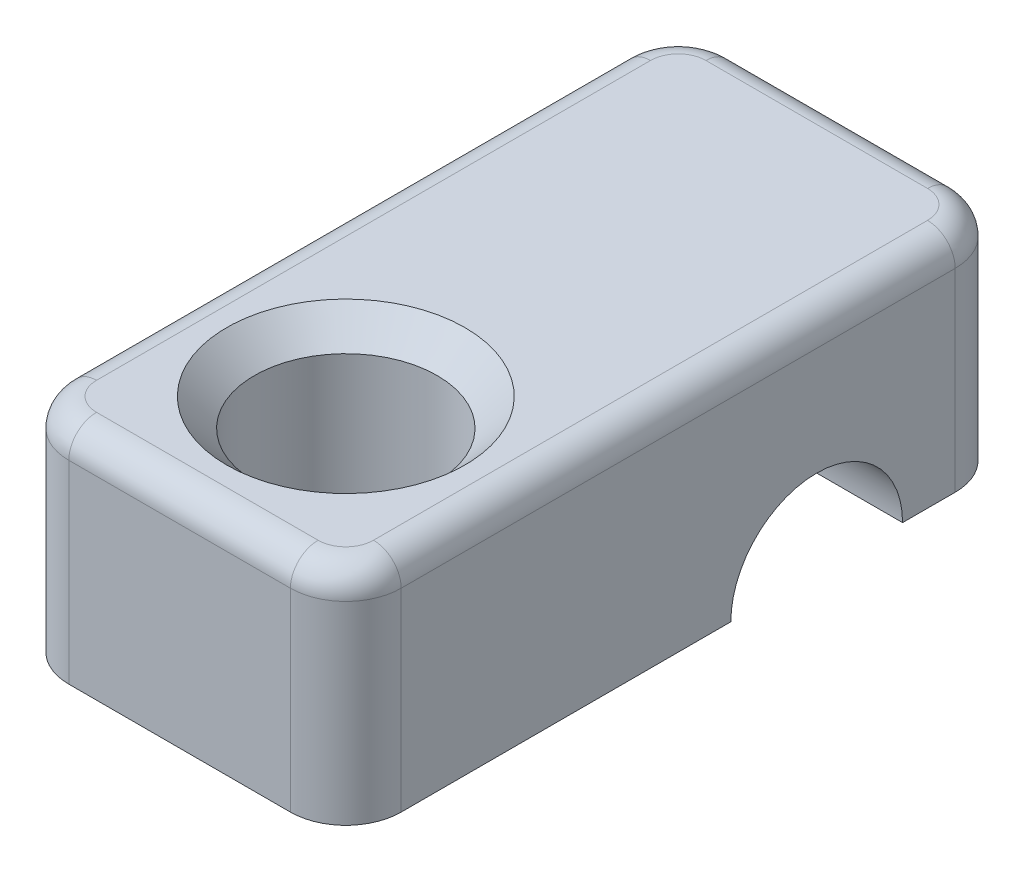
ISO-10303-21;
HEADER;
FILE_DESCRIPTION(('STEP AP214'),'2;1');
FILE_NAME('part.step','',(''),(''),'','','');
FILE_SCHEMA(('AUTOMOTIVE_DESIGN { 1 0 10303 214 1 1 1 1 }'));
ENDSEC;
DATA;
#1=APPLICATION_CONTEXT('core data for automotive mechanical design processes');
#2=APPLICATION_PROTOCOL_DEFINITION('international standard','automotive_design',2000,#1);
#3=PRODUCT_CONTEXT('',#1,'mechanical');
#4=PRODUCT('Part','Part','',(#3));
#5=PRODUCT_RELATED_PRODUCT_CATEGORY('part','',(#4));
#6=PRODUCT_DEFINITION_FORMATION('','',#4);
#7=PRODUCT_DEFINITION_CONTEXT('part definition',#1,'design');
#8=PRODUCT_DEFINITION('design','',#6,#7);
#9=PRODUCT_DEFINITION_SHAPE('','',#8);
#10=(LENGTH_UNIT() NAMED_UNIT(*) SI_UNIT(.MILLI.,.METRE.));
#11=(NAMED_UNIT(*) PLANE_ANGLE_UNIT() SI_UNIT($,.RADIAN.));
#12=(NAMED_UNIT(*) SI_UNIT($,.STERADIAN.) SOLID_ANGLE_UNIT());
#13=UNCERTAINTY_MEASURE_WITH_UNIT(LENGTH_MEASURE(1.E-05),#10,'distance_accuracy_value','');
#14=(GEOMETRIC_REPRESENTATION_CONTEXT(3) GLOBAL_UNCERTAINTY_ASSIGNED_CONTEXT((#13)) GLOBAL_UNIT_ASSIGNED_CONTEXT((#10,
#11,#12)) REPRESENTATION_CONTEXT('',''));
#15=CARTESIAN_POINT('',(0.,0.,0.));
#16=DIRECTION('',(0.,0.,1.));
#17=DIRECTION('',(1.,0.,0.));
#18=AXIS2_PLACEMENT_3D('',#15,#16,#17);
#19=CARTESIAN_POINT('',(6.,0.,0.));
#20=DIRECTION('',(0.,0.,-1.));
#21=DIRECTION('',(-1.,0.,0.));
#22=AXIS2_PLACEMENT_3D('',#19,#20,#21);
#23=PLANE('',#22);
#24=DIRECTION('',(0.,-1.,0.));
#25=VECTOR('',#24,1.);
#26=CARTESIAN_POINT('',(5.,4.,0.));
#27=LINE('',#26,#25);
#28=CARTESIAN_POINT('',(5.,0.,0.));
#29=VERTEX_POINT('',#28);
#30=CARTESIAN_POINT('',(5.,3.5,0.));
#31=VERTEX_POINT('',#30);
#32=EDGE_CURVE('E203',#29,#31,#27,.F.);
#33=ORIENTED_EDGE('',*,*,#32,.T.);
#34=DIRECTION('',(-1.,0.,0.));
#35=VECTOR('',#34,1.);
#36=CARTESIAN_POINT('',(6.,3.5,0.));
#37=LINE('',#36,#35);
#38=CARTESIAN_POINT('',(1.,3.5,0.));
#39=VERTEX_POINT('',#38);
#40=EDGE_CURVE('E59',#31,#39,#37,.T.);
#41=ORIENTED_EDGE('',*,*,#40,.T.);
#42=DIRECTION('',(0.,-1.,0.));
#43=VECTOR('',#42,1.);
#44=CARTESIAN_POINT('',(1.,0.,0.));
#45=LINE('',#44,#43);
#46=CARTESIAN_POINT('',(1.,0.,0.));
#47=VERTEX_POINT('',#46);
#48=EDGE_CURVE('E201',#39,#47,#45,.T.);
#49=ORIENTED_EDGE('',*,*,#48,.T.);
#50=DIRECTION('',(-1.,0.,0.));
#51=VECTOR('',#50,1.);
#52=CARTESIAN_POINT('',(6.,0.,0.));
#53=LINE('',#52,#51);
#54=EDGE_CURVE('E158',#29,#47,#53,.T.);
#55=ORIENTED_EDGE('',*,*,#54,.F.);
#56=EDGE_LOOP('',(#33,#41,#49,#55));
#57=FACE_BOUND('',#56,.T.);
#58=ADVANCED_FACE('F35',(#57),#23,.F.);
#59=CARTESIAN_POINT('',(6.,0.,0.));
#60=DIRECTION('',(0.,1.,0.));
#61=DIRECTION('',(0.,0.,1.));
#62=AXIS2_PLACEMENT_3D('',#59,#60,#61);
#63=PLANE('',#62);
#64=CARTESIAN_POINT('',(3.,0.,-3.));
#65=DIRECTION('',(0.,-1.,0.));
#66=DIRECTION('',(0.,0.,-1.));
#67=AXIS2_PLACEMENT_3D('',#64,#65,#66);
#68=CIRCLE('',#67,1.65);
#69=CARTESIAN_POINT('',(3.,0.,-4.65));
#70=VERTEX_POINT('',#69);
#71=EDGE_CURVE('E172',#70,#70,#68,.T.);
#72=ORIENTED_EDGE('',*,*,#71,.F.);
#73=EDGE_LOOP('',(#72));
#74=FACE_BOUND('',#73,.T.);
#75=DIRECTION('',(0.,0.,-1.));
#76=VECTOR('',#75,1.);
#77=CARTESIAN_POINT('',(6.,0.,0.));
#78=LINE('',#77,#76);
#79=CARTESIAN_POINT('',(6.,0.,-1.));
#80=VERTEX_POINT('',#79);
#81=CARTESIAN_POINT('',(6.,0.,-6.95));
#82=VERTEX_POINT('',#81);
#83=EDGE_CURVE('E137',#80,#82,#78,.T.);
#84=ORIENTED_EDGE('',*,*,#83,.F.);
#85=CARTESIAN_POINT('',(5.,0.,-1.));
#86=DIRECTION('',(0.,1.,0.));
#87=DIRECTION('',(0.,0.,1.));
#88=AXIS2_PLACEMENT_3D('',#85,#86,#87);
#89=CIRCLE('',#88,1.);
#90=EDGE_CURVE('E199',#80,#29,#89,.F.);
#91=ORIENTED_EDGE('',*,*,#90,.T.);
#92=ORIENTED_EDGE('',*,*,#54,.T.);
#93=CARTESIAN_POINT('',(1.,0.,-1.));
#94=DIRECTION('',(0.,1.,0.));
#95=DIRECTION('',(0.,0.,1.));
#96=AXIS2_PLACEMENT_3D('',#93,#94,#95);
#97=CIRCLE('',#96,1.);
#98=CARTESIAN_POINT('',(0.,0.,-1.));
#99=VERTEX_POINT('',#98);
#100=EDGE_CURVE('E197',#47,#99,#97,.F.);
#101=ORIENTED_EDGE('',*,*,#100,.T.);
#102=DIRECTION('',(0.,0.,-1.));
#103=VECTOR('',#102,1.);
#104=CARTESIAN_POINT('',(0.,0.,0.));
#105=LINE('',#104,#103);
#106=CARTESIAN_POINT('',(0.,0.,-6.95));
#107=VERTEX_POINT('',#106);
#108=EDGE_CURVE('E155',#99,#107,#105,.T.);
#109=ORIENTED_EDGE('',*,*,#108,.T.);
#110=DIRECTION('',(-1.,0.,0.));
#111=VECTOR('',#110,1.);
#112=CARTESIAN_POINT('',(6.,0.,-6.95));
#113=LINE('',#112,#111);
#114=EDGE_CURVE('E152',#82,#107,#113,.T.);
#115=ORIENTED_EDGE('',*,*,#114,.F.);
#116=EDGE_LOOP('',(#84,#91,#92,#101,#109,#115));
#117=FACE_BOUND('',#116,.T.);
#118=ADVANCED_FACE('F153',(#74,#117),#63,.F.);
#119=CARTESIAN_POINT('',(6.,0.,-8.5));
#120=DIRECTION('',(-1.,0.,0.));
#121=DIRECTION('',(0.,0.,1.));
#122=AXIS2_PLACEMENT_3D('',#119,#120,#121);
#123=CYLINDRICAL_SURFACE('',#122,1.55);
#124=CARTESIAN_POINT('',(0.,0.,-8.5));
#125=DIRECTION('',(-1.,0.,0.));
#126=DIRECTION('',(0.,0.,-1.));
#127=AXIS2_PLACEMENT_3D('',#124,#125,#126);
#128=CIRCLE('',#127,1.55);
#129=CARTESIAN_POINT('',(0.,0.,-10.05));
#130=VERTEX_POINT('',#129);
#131=EDGE_CURVE('E171',#107,#130,#128,.T.);
#132=ORIENTED_EDGE('',*,*,#131,.T.);
#133=DIRECTION('',(-1.,0.,0.));
#134=VECTOR('',#133,1.);
#135=CARTESIAN_POINT('',(6.,0.,-10.05));
#136=LINE('',#135,#134);
#137=CARTESIAN_POINT('',(6.,0.,-10.05));
#138=VERTEX_POINT('',#137);
#139=EDGE_CURVE('E159',#138,#130,#136,.T.);
#140=ORIENTED_EDGE('',*,*,#139,.F.);
#141=CARTESIAN_POINT('',(6.,0.,-8.5));
#142=DIRECTION('',(-1.,0.,0.));
#143=DIRECTION('',(0.,0.,-1.));
#144=AXIS2_PLACEMENT_3D('',#141,#142,#143);
#145=CIRCLE('',#144,1.55);
#146=EDGE_CURVE('E143',#82,#138,#145,.T.);
#147=ORIENTED_EDGE('',*,*,#146,.F.);
#148=ORIENTED_EDGE('',*,*,#114,.T.);
#149=EDGE_LOOP('',(#132,#140,#147,#148));
#150=FACE_BOUND('',#149,.T.);
#151=ADVANCED_FACE('F161',(#150),#123,.F.);
#152=CARTESIAN_POINT('',(6.,0.,-10.05));
#153=DIRECTION('',(0.,1.,0.));
#154=DIRECTION('',(0.,0.,1.));
#155=AXIS2_PLACEMENT_3D('',#152,#153,#154);
#156=PLANE('',#155);
#157=DIRECTION('',(-1.,0.,0.));
#158=VECTOR('',#157,1.);
#159=CARTESIAN_POINT('',(6.,0.,-12.));
#160=LINE('',#159,#158);
#161=CARTESIAN_POINT('',(5.,0.,-12.));
#162=VERTEX_POINT('',#161);
#163=CARTESIAN_POINT('',(1.,0.,-12.));
#164=VERTEX_POINT('',#163);
#165=EDGE_CURVE('E166',#162,#164,#160,.T.);
#166=ORIENTED_EDGE('',*,*,#165,.F.);
#167=CARTESIAN_POINT('',(5.,0.,-11.));
#168=DIRECTION('',(0.,1.,0.));
#169=DIRECTION('',(0.,0.,1.));
#170=AXIS2_PLACEMENT_3D('',#167,#168,#169);
#171=CIRCLE('',#170,1.);
#172=CARTESIAN_POINT('',(6.,0.,-11.));
#173=VERTEX_POINT('',#172);
#174=EDGE_CURVE('E191',#162,#173,#171,.F.);
#175=ORIENTED_EDGE('',*,*,#174,.T.);
#176=DIRECTION('',(0.,0.,-1.));
#177=VECTOR('',#176,1.);
#178=CARTESIAN_POINT('',(6.,0.,-10.05));
#179=LINE('',#178,#177);
#180=EDGE_CURVE('E164',#138,#173,#179,.T.);
#181=ORIENTED_EDGE('',*,*,#180,.F.);
#182=ORIENTED_EDGE('',*,*,#139,.T.);
#183=DIRECTION('',(0.,0.,-1.));
#184=VECTOR('',#183,1.);
#185=CARTESIAN_POINT('',(0.,0.,-10.05));
#186=LINE('',#185,#184);
#187=CARTESIAN_POINT('',(0.,0.,-11.));
#188=VERTEX_POINT('',#187);
#189=EDGE_CURVE('E149',#130,#188,#186,.T.);
#190=ORIENTED_EDGE('',*,*,#189,.T.);
#191=CARTESIAN_POINT('',(1.,0.,-11.));
#192=DIRECTION('',(0.,1.,0.));
#193=DIRECTION('',(0.,0.,1.));
#194=AXIS2_PLACEMENT_3D('',#191,#192,#193);
#195=CIRCLE('',#194,1.);
#196=EDGE_CURVE('E189',#188,#164,#195,.F.);
#197=ORIENTED_EDGE('',*,*,#196,.T.);
#198=EDGE_LOOP('',(#166,#175,#181,#182,#190,#197));
#199=FACE_BOUND('',#198,.T.);
#200=ADVANCED_FACE('F277',(#199),#156,.F.);
#201=CARTESIAN_POINT('',(6.,4.,-12.));
#202=DIRECTION('',(0.,0.,1.));
#203=DIRECTION('',(1.,0.,0.));
#204=AXIS2_PLACEMENT_3D('',#201,#202,#203);
#205=PLANE('',#204);
#206=DIRECTION('',(0.,1.,0.));
#207=VECTOR('',#206,1.);
#208=CARTESIAN_POINT('',(1.,4.,-12.));
#209=LINE('',#208,#207);
#210=CARTESIAN_POINT('',(1.,3.5,-12.));
#211=VERTEX_POINT('',#210);
#212=EDGE_CURVE('E184',#164,#211,#209,.T.);
#213=ORIENTED_EDGE('',*,*,#212,.T.);
#214=DIRECTION('',(-1.,0.,0.));
#215=VECTOR('',#214,1.);
#216=CARTESIAN_POINT('',(6.,3.5,-12.));
#217=LINE('',#216,#215);
#218=CARTESIAN_POINT('',(5.,3.5,-12.));
#219=VERTEX_POINT('',#218);
#220=EDGE_CURVE('E231',#211,#219,#217,.F.);
#221=ORIENTED_EDGE('',*,*,#220,.T.);
#222=DIRECTION('',(0.,1.,0.));
#223=VECTOR('',#222,1.);
#224=CARTESIAN_POINT('',(5.,0.,-12.));
#225=LINE('',#224,#223);
#226=EDGE_CURVE('E187',#219,#162,#225,.F.);
#227=ORIENTED_EDGE('',*,*,#226,.T.);
#228=ORIENTED_EDGE('',*,*,#165,.T.);
#229=EDGE_LOOP('',(#213,#221,#227,#228));
#230=FACE_BOUND('',#229,.T.);
#231=ADVANCED_FACE('F353',(#230),#205,.F.);
#232=CARTESIAN_POINT('',(6.,4.,0.));
#233=DIRECTION('',(0.,-1.,0.));
#234=DIRECTION('',(0.,0.,-1.));
#235=AXIS2_PLACEMENT_3D('',#232,#233,#234);
#236=PLANE('',#235);
#237=DIRECTION('',(-1.,0.,0.));
#238=VECTOR('',#237,1.);
#239=CARTESIAN_POINT('',(6.,4.,-11.5));
#240=LINE('',#239,#238);
#241=CARTESIAN_POINT('',(5.,4.,-11.5));
#242=VERTEX_POINT('',#241);
#243=CARTESIAN_POINT('',(1.,4.,-11.5));
#244=VERTEX_POINT('',#243);
#245=EDGE_CURVE('E223',#242,#244,#240,.T.);
#246=ORIENTED_EDGE('',*,*,#245,.T.);
#247=CARTESIAN_POINT('',(1.,4.,-11.));
#248=DIRECTION('',(0.,-1.,0.));
#249=DIRECTION('',(0.,0.,-1.));
#250=AXIS2_PLACEMENT_3D('',#247,#248,#249);
#251=CIRCLE('',#250,0.5);
#252=CARTESIAN_POINT('',(0.5,4.,-11.));
#253=VERTEX_POINT('',#252);
#254=EDGE_CURVE('E225',#244,#253,#251,.F.);
#255=ORIENTED_EDGE('',*,*,#254,.T.);
#256=DIRECTION('',(0.,0.,1.));
#257=VECTOR('',#256,1.);
#258=CARTESIAN_POINT('',(0.5,4.,0.));
#259=LINE('',#258,#257);
#260=CARTESIAN_POINT('',(0.5,4.,-1.));
#261=VERTEX_POINT('',#260);
#262=EDGE_CURVE('E211',#253,#261,#259,.T.);
#263=ORIENTED_EDGE('',*,*,#262,.T.);
#264=CARTESIAN_POINT('',(1.,4.,-1.));
#265=DIRECTION('',(0.,-1.,0.));
#266=DIRECTION('',(0.,0.,-1.));
#267=AXIS2_PLACEMENT_3D('',#264,#265,#266);
#268=CIRCLE('',#267,0.5);
#269=CARTESIAN_POINT('',(1.,4.,-0.5));
#270=VERTEX_POINT('',#269);
#271=EDGE_CURVE('E213',#261,#270,#268,.F.);
#272=ORIENTED_EDGE('',*,*,#271,.T.);
#273=DIRECTION('',(-1.,0.,0.));
#274=VECTOR('',#273,1.);
#275=CARTESIAN_POINT('',(6.,4.,-0.5));
#276=LINE('',#275,#274);
#277=CARTESIAN_POINT('',(5.,4.,-0.5));
#278=VERTEX_POINT('',#277);
#279=EDGE_CURVE('E215',#270,#278,#276,.F.);
#280=ORIENTED_EDGE('',*,*,#279,.T.);
#281=CARTESIAN_POINT('',(5.,4.,-1.));
#282=DIRECTION('',(0.,-1.,0.));
#283=DIRECTION('',(0.,0.,-1.));
#284=AXIS2_PLACEMENT_3D('',#281,#282,#283);
#285=CIRCLE('',#284,0.5);
#286=CARTESIAN_POINT('',(5.5,4.,-1.));
#287=VERTEX_POINT('',#286);
#288=EDGE_CURVE('E217',#278,#287,#285,.F.);
#289=ORIENTED_EDGE('',*,*,#288,.T.);
#290=DIRECTION('',(0.,0.,1.));
#291=VECTOR('',#290,1.);
#292=CARTESIAN_POINT('',(5.5,4.,-11.));
#293=LINE('',#292,#291);
#294=CARTESIAN_POINT('',(5.5,4.,-11.));
#295=VERTEX_POINT('',#294);
#296=EDGE_CURVE('E219',#287,#295,#293,.F.);
#297=ORIENTED_EDGE('',*,*,#296,.T.);
#298=CARTESIAN_POINT('',(5.,4.,-11.));
#299=DIRECTION('',(0.,-1.,0.));
#300=DIRECTION('',(0.,0.,-1.));
#301=AXIS2_PLACEMENT_3D('',#298,#299,#300);
#302=CIRCLE('',#301,0.5);
#303=EDGE_CURVE('E221',#295,#242,#302,.F.);
#304=ORIENTED_EDGE('',*,*,#303,.T.);
#305=EDGE_LOOP('',(#246,#255,#263,#272,#280,#289,#297,#304));
#306=FACE_BOUND('',#305,.T.);
#307=CARTESIAN_POINT('',(3.,4.,-3.));
#308=DIRECTION('',(0.,-1.,0.));
#309=DIRECTION('',(0.,0.,-1.));
#310=AXIS2_PLACEMENT_3D('',#307,#308,#309);
#311=CIRCLE('',#310,2.15);
#312=CARTESIAN_POINT('',(3.,4.,-5.15));
#313=VERTEX_POINT('',#312);
#314=EDGE_CURVE('E205',#313,#313,#311,.T.);
#315=ORIENTED_EDGE('',*,*,#314,.T.);
#316=EDGE_LOOP('',(#315));
#317=FACE_BOUND('',#316,.T.);
#318=ADVANCED_FACE('F368',(#306,#317),#236,.F.);
#319=CARTESIAN_POINT('',(6.,0.,-8.5));
#320=DIRECTION('',(1.,0.,0.));
#321=DIRECTION('',(0.,0.,-1.));
#322=AXIS2_PLACEMENT_3D('',#319,#320,#321);
#323=PLANE('',#322);
#324=DIRECTION('',(0.,1.,0.));
#325=VECTOR('',#324,1.);
#326=CARTESIAN_POINT('',(6.,4.,-11.));
#327=LINE('',#326,#325);
#328=CARTESIAN_POINT('',(6.,3.5,-11.));
#329=VERTEX_POINT('',#328);
#330=EDGE_CURVE('E182',#173,#329,#327,.T.);
#331=ORIENTED_EDGE('',*,*,#330,.T.);
#332=DIRECTION('',(0.,0.,1.));
#333=VECTOR('',#332,1.);
#334=CARTESIAN_POINT('',(6.,3.5,-1.));
#335=LINE('',#334,#333);
#336=CARTESIAN_POINT('',(6.,3.5,-1.));
#337=VERTEX_POINT('',#336);
#338=EDGE_CURVE('E235',#329,#337,#335,.T.);
#339=ORIENTED_EDGE('',*,*,#338,.T.);
#340=DIRECTION('',(0.,-1.,0.));
#341=VECTOR('',#340,1.);
#342=CARTESIAN_POINT('',(6.,0.,-1.));
#343=LINE('',#342,#341);
#344=EDGE_CURVE('E146',#337,#80,#343,.T.);
#345=ORIENTED_EDGE('',*,*,#344,.T.);
#346=ORIENTED_EDGE('',*,*,#83,.T.);
#347=ORIENTED_EDGE('',*,*,#146,.T.);
#348=ORIENTED_EDGE('',*,*,#180,.T.);
#349=EDGE_LOOP('',(#331,#339,#345,#346,#347,#348));
#350=FACE_BOUND('',#349,.T.);
#351=ADVANCED_FACE('F140',(#350),#323,.T.);
#352=CARTESIAN_POINT('',(0.,0.,-8.5));
#353=DIRECTION('',(1.,0.,0.));
#354=DIRECTION('',(0.,0.,-1.));
#355=AXIS2_PLACEMENT_3D('',#352,#353,#354);
#356=PLANE('',#355);
#357=DIRECTION('',(0.,-1.,0.));
#358=VECTOR('',#357,1.);
#359=CARTESIAN_POINT('',(0.,0.,-1.));
#360=LINE('',#359,#358);
#361=CARTESIAN_POINT('',(0.,3.5,-1.));
#362=VERTEX_POINT('',#361);
#363=EDGE_CURVE('E193',#99,#362,#360,.F.);
#364=ORIENTED_EDGE('',*,*,#363,.T.);
#365=DIRECTION('',(0.,0.,1.));
#366=VECTOR('',#365,1.);
#367=CARTESIAN_POINT('',(0.,3.5,-8.5));
#368=LINE('',#367,#366);
#369=CARTESIAN_POINT('',(0.,3.5,-11.));
#370=VERTEX_POINT('',#369);
#371=EDGE_CURVE('E11',#362,#370,#368,.F.);
#372=ORIENTED_EDGE('',*,*,#371,.T.);
#373=DIRECTION('',(0.,1.,0.));
#374=VECTOR('',#373,1.);
#375=CARTESIAN_POINT('',(0.,0.,-11.));
#376=LINE('',#375,#374);
#377=EDGE_CURVE('E195',#370,#188,#376,.F.);
#378=ORIENTED_EDGE('',*,*,#377,.T.);
#379=ORIENTED_EDGE('',*,*,#189,.F.);
#380=ORIENTED_EDGE('',*,*,#131,.F.);
#381=ORIENTED_EDGE('',*,*,#108,.F.);
#382=EDGE_LOOP('',(#364,#372,#378,#379,#380,#381));
#383=FACE_BOUND('',#382,.T.);
#384=ADVANCED_FACE('F341',(#383),#356,.F.);
#385=CARTESIAN_POINT('',(3.,6.,-3.));
#386=DIRECTION('',(0.,-1.,0.));
#387=DIRECTION('',(0.,0.,-1.));
#388=AXIS2_PLACEMENT_3D('',#385,#386,#387);
#389=CYLINDRICAL_SURFACE('',#388,1.65);
#390=CARTESIAN_POINT('',(3.,3.5,-3.));
#391=DIRECTION('',(0.,-1.,0.));
#392=DIRECTION('',(0.,0.,-1.));
#393=AXIS2_PLACEMENT_3D('',#390,#391,#392);
#394=CIRCLE('',#393,1.65);
#395=CARTESIAN_POINT('',(3.,3.5,-4.65));
#396=VERTEX_POINT('',#395);
#397=EDGE_CURVE('E208',#396,#396,#394,.F.);
#398=ORIENTED_EDGE('',*,*,#397,.T.);
#399=EDGE_LOOP('',(#398));
#400=FACE_BOUND('',#399,.T.);
#401=ORIENTED_EDGE('',*,*,#71,.T.);
#402=EDGE_LOOP('',(#401));
#403=FACE_BOUND('',#402,.T.);
#404=ADVANCED_FACE('F269',(#400,#403),#389,.F.);
#405=CARTESIAN_POINT('',(5.,0.,-11.));
#406=DIRECTION('',(0.,-1.,0.));
#407=DIRECTION('',(0.,0.,-1.));
#408=AXIS2_PLACEMENT_3D('',#405,#406,#407);
#409=CYLINDRICAL_SURFACE('',#408,1.);
#410=ORIENTED_EDGE('',*,*,#226,.F.);
#411=CARTESIAN_POINT('',(5.,3.5,-11.));
#412=DIRECTION('',(0.,-1.,0.));
#413=DIRECTION('',(0.,0.,-1.));
#414=AXIS2_PLACEMENT_3D('',#411,#412,#413);
#415=CIRCLE('',#414,1.);
#416=EDGE_CURVE('E233',#219,#329,#415,.T.);
#417=ORIENTED_EDGE('',*,*,#416,.T.);
#418=ORIENTED_EDGE('',*,*,#330,.F.);
#419=ORIENTED_EDGE('',*,*,#174,.F.);
#420=EDGE_LOOP('',(#410,#417,#418,#419));
#421=FACE_BOUND('',#420,.T.);
#422=ADVANCED_FACE('F282',(#421),#409,.T.);
#423=CARTESIAN_POINT('',(1.,4.,-11.));
#424=DIRECTION('',(0.,1.,0.));
#425=DIRECTION('',(0.,0.,1.));
#426=AXIS2_PLACEMENT_3D('',#423,#424,#425);
#427=CYLINDRICAL_SURFACE('',#426,1.);
#428=ORIENTED_EDGE('',*,*,#377,.F.);
#429=CARTESIAN_POINT('',(1.,3.5,-11.));
#430=DIRECTION('',(0.,-1.,0.));
#431=DIRECTION('',(0.,0.,-1.));
#432=AXIS2_PLACEMENT_3D('',#429,#430,#431);
#433=CIRCLE('',#432,1.);
#434=EDGE_CURVE('E228',#370,#211,#433,.T.);
#435=ORIENTED_EDGE('',*,*,#434,.T.);
#436=ORIENTED_EDGE('',*,*,#212,.F.);
#437=ORIENTED_EDGE('',*,*,#196,.F.);
#438=EDGE_LOOP('',(#428,#435,#436,#437));
#439=FACE_BOUND('',#438,.T.);
#440=ADVANCED_FACE('F285',(#439),#427,.T.);
#441=CARTESIAN_POINT('',(5.,0.,-1.));
#442=DIRECTION('',(0.,1.,0.));
#443=DIRECTION('',(0.,0.,1.));
#444=AXIS2_PLACEMENT_3D('',#441,#442,#443);
#445=CYLINDRICAL_SURFACE('',#444,1.);
#446=ORIENTED_EDGE('',*,*,#344,.F.);
#447=CARTESIAN_POINT('',(5.,3.5,-1.));
#448=DIRECTION('',(0.,-1.,0.));
#449=DIRECTION('',(0.,0.,-1.));
#450=AXIS2_PLACEMENT_3D('',#447,#448,#449);
#451=CIRCLE('',#450,1.);
#452=EDGE_CURVE('E237',#337,#31,#451,.T.);
#453=ORIENTED_EDGE('',*,*,#452,.T.);
#454=ORIENTED_EDGE('',*,*,#32,.F.);
#455=ORIENTED_EDGE('',*,*,#90,.F.);
#456=EDGE_LOOP('',(#446,#453,#454,#455));
#457=FACE_BOUND('',#456,.T.);
#458=ADVANCED_FACE('F289',(#457),#445,.T.);
#459=CARTESIAN_POINT('',(1.,0.,-1.));
#460=DIRECTION('',(0.,-1.,0.));
#461=DIRECTION('',(0.,0.,-1.));
#462=AXIS2_PLACEMENT_3D('',#459,#460,#461);
#463=CYLINDRICAL_SURFACE('',#462,1.);
#464=ORIENTED_EDGE('',*,*,#48,.F.);
#465=CARTESIAN_POINT('',(1.,3.5,-1.));
#466=DIRECTION('',(0.,-1.,0.));
#467=DIRECTION('',(0.,0.,-1.));
#468=AXIS2_PLACEMENT_3D('',#465,#466,#467);
#469=CIRCLE('',#468,1.);
#470=EDGE_CURVE('E44',#39,#362,#469,.T.);
#471=ORIENTED_EDGE('',*,*,#470,.T.);
#472=ORIENTED_EDGE('',*,*,#363,.F.);
#473=ORIENTED_EDGE('',*,*,#100,.F.);
#474=EDGE_LOOP('',(#464,#471,#472,#473));
#475=FACE_BOUND('',#474,.T.);
#476=ADVANCED_FACE('F293',(#475),#463,.T.);
#477=CARTESIAN_POINT('',(3.,4.,-3.));
#478=DIRECTION('',(0.,1.,0.));
#479=DIRECTION('',(0.,0.,1.));
#480=AXIS2_PLACEMENT_3D('',#477,#478,#479);
#481=CONICAL_SURFACE('',#480,2.15,0.785398163397449);
#482=ORIENTED_EDGE('',*,*,#397,.F.);
#483=EDGE_LOOP('',(#482));
#484=FACE_BOUND('',#483,.T.);
#485=ORIENTED_EDGE('',*,*,#314,.F.);
#486=EDGE_LOOP('',(#485));
#487=FACE_BOUND('',#486,.T.);
#488=ADVANCED_FACE('F297',(#484,#487),#481,.F.);
#489=CARTESIAN_POINT('',(5.,3.5,-1.));
#490=DIRECTION('',(0.,-1.,0.));
#491=DIRECTION('',(0.,0.,-1.));
#492=AXIS2_PLACEMENT_3D('',#489,#490,#491);
#493=DEGENERATE_TOROIDAL_SURFACE('',#492,0.5,0.5,.T.);
#494=CARTESIAN_POINT('',(5.,3.5,-0.5));
#495=DIRECTION('',(-1.,0.,0.));
#496=DIRECTION('',(0.,0.,1.));
#497=AXIS2_PLACEMENT_3D('',#494,#495,#496);
#498=CIRCLE('',#497,0.5);
#499=EDGE_CURVE('E256',#31,#278,#498,.T.);
#500=ORIENTED_EDGE('',*,*,#499,.F.);
#501=ORIENTED_EDGE('',*,*,#452,.F.);
#502=CARTESIAN_POINT('',(5.5,3.5,-1.));
#503=DIRECTION('',(0.,0.,-1.));
#504=DIRECTION('',(-1.,0.,0.));
#505=AXIS2_PLACEMENT_3D('',#502,#503,#504);
#506=CIRCLE('',#505,0.5);
#507=EDGE_CURVE('E39',#287,#337,#506,.T.);
#508=ORIENTED_EDGE('',*,*,#507,.F.);
#509=ORIENTED_EDGE('',*,*,#288,.F.);
#510=EDGE_LOOP('',(#500,#501,#508,#509));
#511=FACE_BOUND('',#510,.T.);
#512=ADVANCED_FACE('F37',(#511),#493,.T.);
#513=CARTESIAN_POINT('',(5.5,3.5,-8.5));
#514=DIRECTION('',(0.,0.,-1.));
#515=DIRECTION('',(-1.,0.,0.));
#516=AXIS2_PLACEMENT_3D('',#513,#514,#515);
#517=CYLINDRICAL_SURFACE('',#516,0.5);
#518=ORIENTED_EDGE('',*,*,#507,.T.);
#519=ORIENTED_EDGE('',*,*,#338,.F.);
#520=CARTESIAN_POINT('',(5.5,3.5,-11.));
#521=DIRECTION('',(0.,0.,-1.));
#522=DIRECTION('',(-1.,0.,0.));
#523=AXIS2_PLACEMENT_3D('',#520,#521,#522);
#524=CIRCLE('',#523,0.5);
#525=EDGE_CURVE('E254',#295,#329,#524,.T.);
#526=ORIENTED_EDGE('',*,*,#525,.F.);
#527=ORIENTED_EDGE('',*,*,#296,.F.);
#528=EDGE_LOOP('',(#518,#519,#526,#527));
#529=FACE_BOUND('',#528,.T.);
#530=ADVANCED_FACE('F323',(#529),#517,.T.);
#531=CARTESIAN_POINT('',(6.,3.5,-0.5));
#532=DIRECTION('',(-1.,0.,0.));
#533=DIRECTION('',(0.,0.,1.));
#534=AXIS2_PLACEMENT_3D('',#531,#532,#533);
#535=CYLINDRICAL_SURFACE('',#534,0.5);
#536=ORIENTED_EDGE('',*,*,#499,.T.);
#537=ORIENTED_EDGE('',*,*,#279,.F.);
#538=CARTESIAN_POINT('',(1.,3.5,-0.5));
#539=DIRECTION('',(-1.,0.,0.));
#540=DIRECTION('',(0.,0.,1.));
#541=AXIS2_PLACEMENT_3D('',#538,#539,#540);
#542=CIRCLE('',#541,0.5);
#543=EDGE_CURVE('E251',#39,#270,#542,.T.);
#544=ORIENTED_EDGE('',*,*,#543,.F.);
#545=ORIENTED_EDGE('',*,*,#40,.F.);
#546=EDGE_LOOP('',(#536,#537,#544,#545));
#547=FACE_BOUND('',#546,.T.);
#548=ADVANCED_FACE('F320',(#547),#535,.T.);
#549=CARTESIAN_POINT('',(5.,3.5,-11.));
#550=DIRECTION('',(0.,-1.,0.));
#551=DIRECTION('',(0.,0.,-1.));
#552=AXIS2_PLACEMENT_3D('',#549,#550,#551);
#553=DEGENERATE_TOROIDAL_SURFACE('',#552,0.5,0.5,.T.);
#554=ORIENTED_EDGE('',*,*,#525,.T.);
#555=ORIENTED_EDGE('',*,*,#416,.F.);
#556=CARTESIAN_POINT('',(5.,3.5,-11.5));
#557=DIRECTION('',(-1.,0.,0.));
#558=DIRECTION('',(0.,0.,1.));
#559=AXIS2_PLACEMENT_3D('',#556,#557,#558);
#560=CIRCLE('',#559,0.5);
#561=EDGE_CURVE('E248',#242,#219,#560,.T.);
#562=ORIENTED_EDGE('',*,*,#561,.F.);
#563=ORIENTED_EDGE('',*,*,#303,.F.);
#564=EDGE_LOOP('',(#554,#555,#562,#563));
#565=FACE_BOUND('',#564,.T.);
#566=ADVANCED_FACE('F316',(#565),#553,.T.);
#567=CARTESIAN_POINT('',(1.,3.5,-1.));
#568=DIRECTION('',(0.,-1.,0.));
#569=DIRECTION('',(0.,0.,-1.));
#570=AXIS2_PLACEMENT_3D('',#567,#568,#569);
#571=DEGENERATE_TOROIDAL_SURFACE('',#570,0.5,0.5,.T.);
#572=ORIENTED_EDGE('',*,*,#543,.T.);
#573=ORIENTED_EDGE('',*,*,#271,.F.);
#574=CARTESIAN_POINT('',(0.5,3.5,-1.));
#575=DIRECTION('',(0.,0.,-1.));
#576=DIRECTION('',(-1.,0.,0.));
#577=AXIS2_PLACEMENT_3D('',#574,#575,#576);
#578=CIRCLE('',#577,0.5);
#579=EDGE_CURVE('E245',#362,#261,#578,.T.);
#580=ORIENTED_EDGE('',*,*,#579,.F.);
#581=ORIENTED_EDGE('',*,*,#470,.F.);
#582=EDGE_LOOP('',(#572,#573,#580,#581));
#583=FACE_BOUND('',#582,.T.);
#584=ADVANCED_FACE('F312',(#583),#571,.T.);
#585=CARTESIAN_POINT('',(6.,3.5,-11.5));
#586=DIRECTION('',(-1.,0.,0.));
#587=DIRECTION('',(0.,0.,1.));
#588=AXIS2_PLACEMENT_3D('',#585,#586,#587);
#589=CYLINDRICAL_SURFACE('',#588,0.5);
#590=ORIENTED_EDGE('',*,*,#561,.T.);
#591=ORIENTED_EDGE('',*,*,#220,.F.);
#592=CARTESIAN_POINT('',(1.,3.5,-11.5));
#593=DIRECTION('',(-1.,0.,0.));
#594=DIRECTION('',(0.,0.,1.));
#595=AXIS2_PLACEMENT_3D('',#592,#593,#594);
#596=CIRCLE('',#595,0.5);
#597=EDGE_CURVE('E243',#244,#211,#596,.T.);
#598=ORIENTED_EDGE('',*,*,#597,.F.);
#599=ORIENTED_EDGE('',*,*,#245,.F.);
#600=EDGE_LOOP('',(#590,#591,#598,#599));
#601=FACE_BOUND('',#600,.T.);
#602=ADVANCED_FACE('F308',(#601),#589,.T.);
#603=CARTESIAN_POINT('',(0.5,3.5,0.));
#604=DIRECTION('',(0.,0.,1.));
#605=DIRECTION('',(1.,0.,0.));
#606=AXIS2_PLACEMENT_3D('',#603,#604,#605);
#607=CYLINDRICAL_SURFACE('',#606,0.5);
#608=ORIENTED_EDGE('',*,*,#579,.T.);
#609=ORIENTED_EDGE('',*,*,#262,.F.);
#610=CARTESIAN_POINT('',(0.5,3.5,-11.));
#611=DIRECTION('',(0.,0.,-1.));
#612=DIRECTION('',(-1.,0.,0.));
#613=AXIS2_PLACEMENT_3D('',#610,#611,#612);
#614=CIRCLE('',#613,0.5);
#615=EDGE_CURVE('E241',#370,#253,#614,.T.);
#616=ORIENTED_EDGE('',*,*,#615,.F.);
#617=ORIENTED_EDGE('',*,*,#371,.F.);
#618=EDGE_LOOP('',(#608,#609,#616,#617));
#619=FACE_BOUND('',#618,.T.);
#620=ADVANCED_FACE('F304',(#619),#607,.T.);
#621=CARTESIAN_POINT('',(1.,3.5,-11.));
#622=DIRECTION('',(0.,-1.,0.));
#623=DIRECTION('',(0.,0.,-1.));
#624=AXIS2_PLACEMENT_3D('',#621,#622,#623);
#625=DEGENERATE_TOROIDAL_SURFACE('',#624,0.5,0.5,.T.);
#626=ORIENTED_EDGE('',*,*,#597,.T.);
#627=ORIENTED_EDGE('',*,*,#434,.F.);
#628=ORIENTED_EDGE('',*,*,#615,.T.);
#629=ORIENTED_EDGE('',*,*,#254,.F.);
#630=EDGE_LOOP('',(#626,#627,#628,#629));
#631=FACE_BOUND('',#630,.T.);
#632=ADVANCED_FACE('F301',(#631),#625,.T.);
#633=CLOSED_SHELL('',(#58,#118,#151,#200,#231,#318,#351,#384,#404,#422,#440,#458,#476,#488,#512,
#530,#548,#566,#584,#602,#620,#632));
#634=MANIFOLD_SOLID_BREP('B2',#633);
#635=ADVANCED_BREP_SHAPE_REPRESENTATION('',(#18,#634),#14);
#636=SHAPE_DEFINITION_REPRESENTATION(#9,#635);
ENDSEC;
END-ISO-10303-21;
